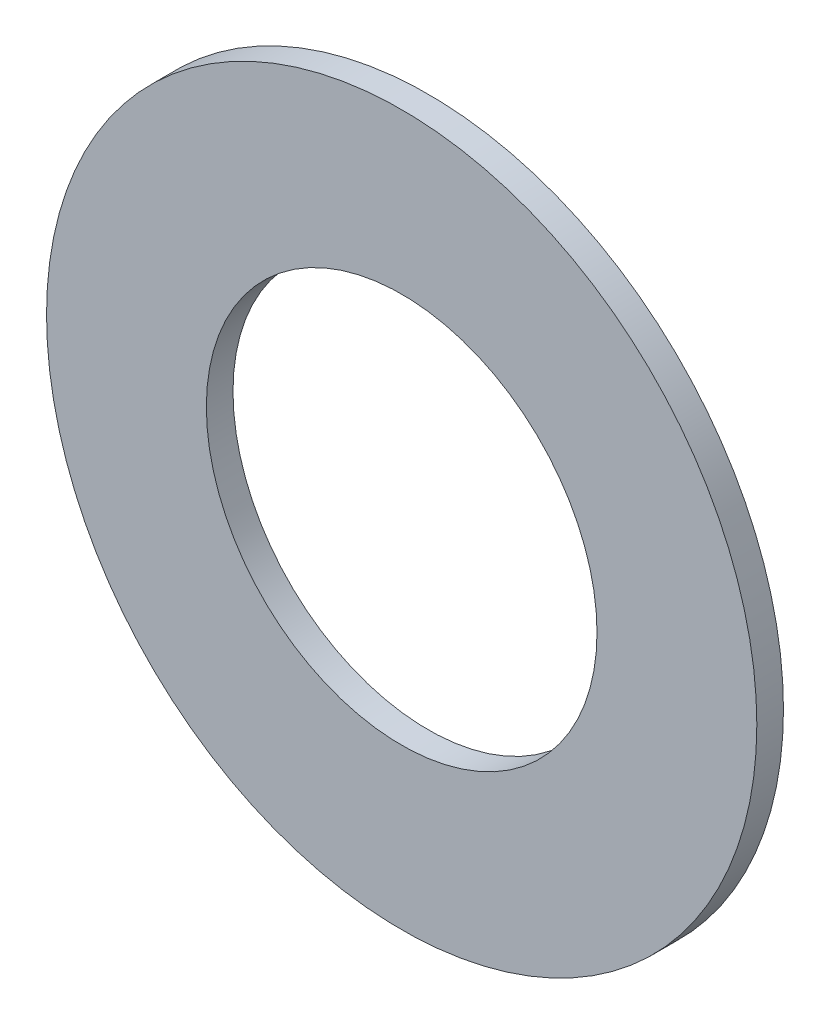
ISO-10303-21;
HEADER;
FILE_DESCRIPTION(('STEP AP214'),'2;1');
FILE_NAME('part.step','',(''),(''),'','','');
FILE_SCHEMA(('AUTOMOTIVE_DESIGN { 1 0 10303 214 1 1 1 1 }'));
ENDSEC;
DATA;
#1=APPLICATION_CONTEXT('core data for automotive mechanical design processes');
#2=APPLICATION_PROTOCOL_DEFINITION('international standard','automotive_design',2000,#1);
#3=PRODUCT_CONTEXT('',#1,'mechanical');
#4=PRODUCT('Part','Part','',(#3));
#5=PRODUCT_RELATED_PRODUCT_CATEGORY('part','',(#4));
#6=PRODUCT_DEFINITION_FORMATION('','',#4);
#7=PRODUCT_DEFINITION_CONTEXT('part definition',#1,'design');
#8=PRODUCT_DEFINITION('design','',#6,#7);
#9=PRODUCT_DEFINITION_SHAPE('','',#8);
#10=(LENGTH_UNIT() NAMED_UNIT(*) SI_UNIT(.MILLI.,.METRE.));
#11=(NAMED_UNIT(*) PLANE_ANGLE_UNIT() SI_UNIT($,.RADIAN.));
#12=(NAMED_UNIT(*) SI_UNIT($,.STERADIAN.) SOLID_ANGLE_UNIT());
#13=UNCERTAINTY_MEASURE_WITH_UNIT(LENGTH_MEASURE(1.E-05),#10,'distance_accuracy_value','');
#14=(GEOMETRIC_REPRESENTATION_CONTEXT(3) GLOBAL_UNCERTAINTY_ASSIGNED_CONTEXT((#13)) GLOBAL_UNIT_ASSIGNED_CONTEXT((#10,
#11,#12)) REPRESENTATION_CONTEXT('',''));
#15=CARTESIAN_POINT('',(0.,0.,0.));
#16=DIRECTION('',(0.,0.,1.));
#17=DIRECTION('',(1.,0.,0.));
#18=AXIS2_PLACEMENT_3D('',#15,#16,#17);
#19=CARTESIAN_POINT('',(0.,0.,0.75));
#20=DIRECTION('',(0.,0.,1.));
#21=DIRECTION('',(1.,0.,0.));
#22=AXIS2_PLACEMENT_3D('',#19,#20,#21);
#23=PLANE('',#22);
#24=CARTESIAN_POINT('',(0.,0.,0.75));
#25=DIRECTION('',(0.,0.,1.));
#26=DIRECTION('',(1.,0.,0.));
#27=AXIS2_PLACEMENT_3D('',#24,#25,#26);
#28=CIRCLE('',#27,10.);
#29=CARTESIAN_POINT('',(10.,0.,0.75));
#30=VERTEX_POINT('',#29);
#31=EDGE_CURVE('E10',#30,#30,#28,.T.);
#32=ORIENTED_EDGE('',*,*,#31,.T.);
#33=EDGE_LOOP('',(#32));
#34=FACE_BOUND('',#33,.T.);
#35=CARTESIAN_POINT('',(0.,0.,0.75));
#36=DIRECTION('',(0.,0.,1.));
#37=DIRECTION('',(1.,0.,0.));
#38=AXIS2_PLACEMENT_3D('',#35,#36,#37);
#39=CIRCLE('',#38,5.5);
#40=CARTESIAN_POINT('',(5.5,0.,0.75));
#41=VERTEX_POINT('',#40);
#42=EDGE_CURVE('E55',#41,#41,#39,.T.);
#43=ORIENTED_EDGE('',*,*,#42,.F.);
#44=EDGE_LOOP('',(#43));
#45=FACE_BOUND('',#44,.T.);
#46=ADVANCED_FACE('F41',(#34,#45),#23,.T.);
#47=CARTESIAN_POINT('',(0.,0.,0.));
#48=DIRECTION('',(0.,0.,1.));
#49=DIRECTION('',(1.,0.,0.));
#50=AXIS2_PLACEMENT_3D('',#47,#48,#49);
#51=PLANE('',#50);
#52=CARTESIAN_POINT('',(0.,0.,0.));
#53=DIRECTION('',(0.,0.,1.));
#54=DIRECTION('',(1.,0.,0.));
#55=AXIS2_PLACEMENT_3D('',#52,#53,#54);
#56=CIRCLE('',#55,10.);
#57=CARTESIAN_POINT('',(10.,0.,0.));
#58=VERTEX_POINT('',#57);
#59=EDGE_CURVE('E45',#58,#58,#56,.T.);
#60=ORIENTED_EDGE('',*,*,#59,.F.);
#61=EDGE_LOOP('',(#60));
#62=FACE_BOUND('',#61,.T.);
#63=CARTESIAN_POINT('',(0.,0.,0.));
#64=DIRECTION('',(0.,0.,1.));
#65=DIRECTION('',(1.,0.,0.));
#66=AXIS2_PLACEMENT_3D('',#63,#64,#65);
#67=CIRCLE('',#66,5.5);
#68=CARTESIAN_POINT('',(5.5,0.,0.));
#69=VERTEX_POINT('',#68);
#70=EDGE_CURVE('E57',#69,#69,#67,.T.);
#71=ORIENTED_EDGE('',*,*,#70,.T.);
#72=EDGE_LOOP('',(#71));
#73=FACE_BOUND('',#72,.T.);
#74=ADVANCED_FACE('F70',(#62,#73),#51,.F.);
#75=CARTESIAN_POINT('',(0.,0.,0.75));
#76=DIRECTION('',(0.,0.,-1.));
#77=DIRECTION('',(-1.,0.,0.));
#78=AXIS2_PLACEMENT_3D('',#75,#76,#77);
#79=CYLINDRICAL_SURFACE('',#78,10.);
#80=ORIENTED_EDGE('',*,*,#31,.F.);
#81=EDGE_LOOP('',(#80));
#82=FACE_BOUND('',#81,.T.);
#83=ORIENTED_EDGE('',*,*,#59,.T.);
#84=EDGE_LOOP('',(#83));
#85=FACE_BOUND('',#84,.T.);
#86=ADVANCED_FACE('F43',(#82,#85),#79,.T.);
#87=CARTESIAN_POINT('',(0.,0.,0.75));
#88=DIRECTION('',(0.,0.,-1.));
#89=DIRECTION('',(-1.,0.,0.));
#90=AXIS2_PLACEMENT_3D('',#87,#88,#89);
#91=CYLINDRICAL_SURFACE('',#90,5.5);
#92=ORIENTED_EDGE('',*,*,#42,.T.);
#93=EDGE_LOOP('',(#92));
#94=FACE_BOUND('',#93,.T.);
#95=ORIENTED_EDGE('',*,*,#70,.F.);
#96=EDGE_LOOP('',(#95));
#97=FACE_BOUND('',#96,.T.);
#98=ADVANCED_FACE('F66',(#94,#97),#91,.F.);
#99=CLOSED_SHELL('',(#46,#74,#86,#98));
#100=MANIFOLD_SOLID_BREP('B2',#99);
#101=ADVANCED_BREP_SHAPE_REPRESENTATION('',(#18,#100),#14);
#102=SHAPE_DEFINITION_REPRESENTATION(#9,#101);
ENDSEC;
END-ISO-10303-21;
